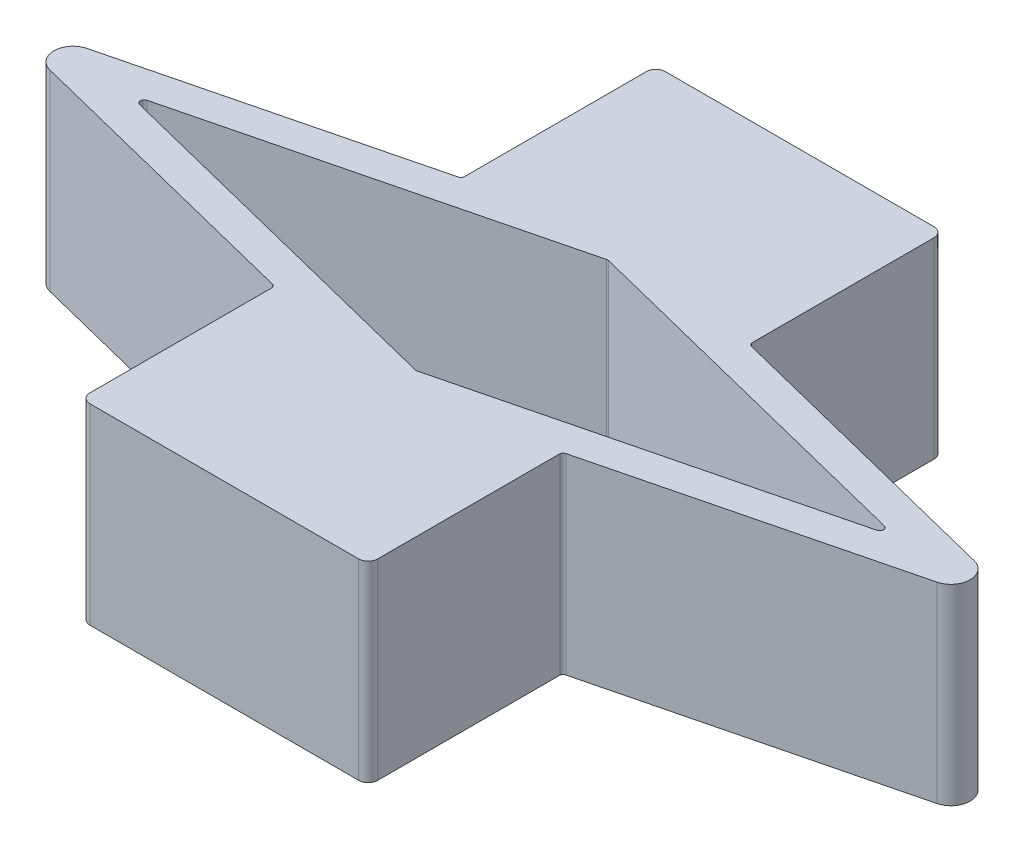
ISO-10303-21;
HEADER;
FILE_DESCRIPTION(('STEP AP214'),'2;1');
FILE_NAME('part.step','',(''),(''),'','','');
FILE_SCHEMA(('AUTOMOTIVE_DESIGN { 1 0 10303 214 1 1 1 1 }'));
ENDSEC;
DATA;
#1=APPLICATION_CONTEXT('core data for automotive mechanical design processes');
#2=APPLICATION_PROTOCOL_DEFINITION('international standard','automotive_design',2000,#1);
#3=PRODUCT_CONTEXT('',#1,'mechanical');
#4=PRODUCT('Part','Part','',(#3));
#5=PRODUCT_RELATED_PRODUCT_CATEGORY('part','',(#4));
#6=PRODUCT_DEFINITION_FORMATION('','',#4);
#7=PRODUCT_DEFINITION_CONTEXT('part definition',#1,'design');
#8=PRODUCT_DEFINITION('design','',#6,#7);
#9=PRODUCT_DEFINITION_SHAPE('','',#8);
#10=(LENGTH_UNIT() NAMED_UNIT(*) SI_UNIT(.MILLI.,.METRE.));
#11=(NAMED_UNIT(*) PLANE_ANGLE_UNIT() SI_UNIT($,.RADIAN.));
#12=(NAMED_UNIT(*) SI_UNIT($,.STERADIAN.) SOLID_ANGLE_UNIT());
#13=UNCERTAINTY_MEASURE_WITH_UNIT(LENGTH_MEASURE(1.E-05),#10,'distance_accuracy_value','');
#14=(GEOMETRIC_REPRESENTATION_CONTEXT(3) GLOBAL_UNCERTAINTY_ASSIGNED_CONTEXT((#13)) GLOBAL_UNIT_ASSIGNED_CONTEXT((#10,
#11,#12)) REPRESENTATION_CONTEXT('',''));
#15=CARTESIAN_POINT('',(0.,0.,0.));
#16=DIRECTION('',(0.,0.,1.));
#17=DIRECTION('',(1.,0.,0.));
#18=AXIS2_PLACEMENT_3D('',#15,#16,#17);
#19=CARTESIAN_POINT('',(7.5,10.,0.));
#20=DIRECTION('',(-1.,0.,0.));
#21=DIRECTION('',(0.,0.,1.));
#22=AXIS2_PLACEMENT_3D('',#19,#20,#21);
#23=PLANE('',#22);
#24=DIRECTION('',(0.,0.,-1.));
#25=VECTOR('',#24,1.);
#26=CARTESIAN_POINT('',(7.5,0.,0.));
#27=LINE('',#26,#25);
#28=CARTESIAN_POINT('',(7.5,0.,-15.));
#29=VERTEX_POINT('',#28);
#30=CARTESIAN_POINT('',(7.5,0.,-24.5));
#31=VERTEX_POINT('',#30);
#32=EDGE_CURVE('E422',#29,#31,#27,.T.);
#33=ORIENTED_EDGE('',*,*,#32,.T.);
#34=DIRECTION('',(0.,-1.,0.));
#35=VECTOR('',#34,1.);
#36=CARTESIAN_POINT('',(7.5,10.,-24.5));
#37=LINE('',#36,#35);
#38=CARTESIAN_POINT('',(7.5,10.,-24.5));
#39=VERTEX_POINT('',#38);
#40=EDGE_CURVE('E354',#31,#39,#37,.F.);
#41=ORIENTED_EDGE('',*,*,#40,.T.);
#42=DIRECTION('',(0.,0.,-1.));
#43=VECTOR('',#42,1.);
#44=CARTESIAN_POINT('',(7.5,10.,0.));
#45=LINE('',#44,#43);
#46=CARTESIAN_POINT('',(7.5,10.,-15.));
#47=VERTEX_POINT('',#46);
#48=EDGE_CURVE('E436',#47,#39,#45,.T.);
#49=ORIENTED_EDGE('',*,*,#48,.F.);
#50=DIRECTION('',(0.,-1.,0.));
#51=VECTOR('',#50,1.);
#52=CARTESIAN_POINT('',(7.5,10.,-15.));
#53=LINE('',#52,#51);
#54=EDGE_CURVE('E461',#47,#29,#53,.T.);
#55=ORIENTED_EDGE('',*,*,#54,.T.);
#56=EDGE_LOOP('',(#33,#41,#49,#55));
#57=FACE_BOUND('',#56,.T.);
#58=ADVANCED_FACE('F42',(#57),#23,.F.);
#59=CARTESIAN_POINT('',(0.,10.,-25.));
#60=DIRECTION('',(0.,0.,-1.));
#61=DIRECTION('',(-1.,0.,0.));
#62=AXIS2_PLACEMENT_3D('',#59,#60,#61);
#63=PLANE('',#62);
#64=DIRECTION('',(1.,0.,0.));
#65=VECTOR('',#64,1.);
#66=CARTESIAN_POINT('',(0.,10.,-25.));
#67=LINE('',#66,#65);
#68=CARTESIAN_POINT('',(-7.,10.,-25.));
#69=VERTEX_POINT('',#68);
#70=CARTESIAN_POINT('',(7.,10.,-25.));
#71=VERTEX_POINT('',#70);
#72=EDGE_CURVE('E439',#69,#71,#67,.T.);
#73=ORIENTED_EDGE('',*,*,#72,.T.);
#74=DIRECTION('',(0.,-1.,0.));
#75=VECTOR('',#74,1.);
#76=CARTESIAN_POINT('',(7.,0.,-25.));
#77=LINE('',#76,#75);
#78=CARTESIAN_POINT('',(7.,0.,-25.));
#79=VERTEX_POINT('',#78);
#80=EDGE_CURVE('E338',#71,#79,#77,.T.);
#81=ORIENTED_EDGE('',*,*,#80,.T.);
#82=DIRECTION('',(1.,0.,0.));
#83=VECTOR('',#82,1.);
#84=CARTESIAN_POINT('',(0.,0.,-25.));
#85=LINE('',#84,#83);
#86=CARTESIAN_POINT('',(-7.,0.,-25.));
#87=VERTEX_POINT('',#86);
#88=EDGE_CURVE('E452',#87,#79,#85,.T.);
#89=ORIENTED_EDGE('',*,*,#88,.F.);
#90=DIRECTION('',(0.,-1.,0.));
#91=VECTOR('',#90,1.);
#92=CARTESIAN_POINT('',(-7.,10.,-25.));
#93=LINE('',#92,#91);
#94=EDGE_CURVE('E335',#87,#69,#93,.F.);
#95=ORIENTED_EDGE('',*,*,#94,.T.);
#96=EDGE_LOOP('',(#73,#81,#89,#95));
#97=FACE_BOUND('',#96,.T.);
#98=ADVANCED_FACE('F597',(#97),#63,.T.);
#99=CARTESIAN_POINT('',(-7.5,10.,0.));
#100=DIRECTION('',(-1.,0.,0.));
#101=DIRECTION('',(0.,0.,1.));
#102=AXIS2_PLACEMENT_3D('',#99,#100,#101);
#103=PLANE('',#102);
#104=DIRECTION('',(0.,0.,-1.));
#105=VECTOR('',#104,1.);
#106=CARTESIAN_POINT('',(-7.5,10.,0.));
#107=LINE('',#106,#105);
#108=CARTESIAN_POINT('',(-7.5,10.,-15.));
#109=VERTEX_POINT('',#108);
#110=CARTESIAN_POINT('',(-7.5,10.,-24.5));
#111=VERTEX_POINT('',#110);
#112=EDGE_CURVE('E444',#109,#111,#107,.T.);
#113=ORIENTED_EDGE('',*,*,#112,.T.);
#114=DIRECTION('',(0.,-1.,0.));
#115=VECTOR('',#114,1.);
#116=CARTESIAN_POINT('',(-7.5,10.,-24.5));
#117=LINE('',#116,#115);
#118=CARTESIAN_POINT('',(-7.5,0.,-24.5));
#119=VERTEX_POINT('',#118);
#120=EDGE_CURVE('E368',#111,#119,#117,.T.);
#121=ORIENTED_EDGE('',*,*,#120,.T.);
#122=DIRECTION('',(0.,0.,-1.));
#123=VECTOR('',#122,1.);
#124=CARTESIAN_POINT('',(-7.5,0.,0.));
#125=LINE('',#124,#123);
#126=CARTESIAN_POINT('',(-7.5,0.,-15.));
#127=VERTEX_POINT('',#126);
#128=EDGE_CURVE('E440',#127,#119,#125,.T.);
#129=ORIENTED_EDGE('',*,*,#128,.F.);
#130=DIRECTION('',(0.,-1.,0.));
#131=VECTOR('',#130,1.);
#132=CARTESIAN_POINT('',(-7.5,10.,-15.));
#133=LINE('',#132,#131);
#134=EDGE_CURVE('E448',#109,#127,#133,.T.);
#135=ORIENTED_EDGE('',*,*,#134,.F.);
#136=EDGE_LOOP('',(#113,#121,#129,#135));
#137=FACE_BOUND('',#136,.T.);
#138=ADVANCED_FACE('F604',(#137),#103,.T.);
#139=CARTESIAN_POINT('',(0.,10.,0.));
#140=DIRECTION('',(0.,1.,0.));
#141=DIRECTION('',(0.,0.,1.));
#142=AXIS2_PLACEMENT_3D('',#139,#140,#141);
#143=PLANE('',#142);
#144=ORIENTED_EDGE('',*,*,#48,.T.);
#145=CARTESIAN_POINT('',(7.,10.,-24.5));
#146=DIRECTION('',(0.,1.,0.));
#147=DIRECTION('',(0.,0.,1.));
#148=AXIS2_PLACEMENT_3D('',#145,#146,#147);
#149=CIRCLE('',#148,0.5);
#150=EDGE_CURVE('E365',#39,#71,#149,.T.);
#151=ORIENTED_EDGE('',*,*,#150,.T.);
#152=ORIENTED_EDGE('',*,*,#72,.F.);
#153=CARTESIAN_POINT('',(-7.,10.,-24.5));
#154=DIRECTION('',(0.,1.,0.));
#155=DIRECTION('',(0.,0.,1.));
#156=AXIS2_PLACEMENT_3D('',#153,#154,#155);
#157=CIRCLE('',#156,0.5);
#158=EDGE_CURVE('E362',#69,#111,#157,.T.);
#159=ORIENTED_EDGE('',*,*,#158,.T.);
#160=ORIENTED_EDGE('',*,*,#112,.F.);
#161=CARTESIAN_POINT('',(-7.6970520970072,10.,-15.0342121479166));
#162=DIRECTION('',(0.,1.,0.));
#163=DIRECTION('',(0.,0.,1.));
#164=AXIS2_PLACEMENT_3D('',#161,#162,#163);
#165=CIRCLE('',#164,0.2);
#166=CARTESIAN_POINT('',(-7.64854497199993,10.,-14.8401836478875));
#167=VERTEX_POINT('',#166);
#168=EDGE_CURVE('E274',#109,#167,#165,.F.);
#169=ORIENTED_EDGE('',*,*,#168,.T.);
#170=DIRECTION('',(-0.970142500145332,0.,0.242535625036333));
#171=VECTOR('',#170,1.);
#172=CARTESIAN_POINT('',(-3.94172232726765,10.,-15.7668893090706));
#173=LINE('',#172,#171);
#174=CARTESIAN_POINT('',(-23.1287095629687,10.,-10.9701425001453));
#175=VERTEX_POINT('',#174);
#176=EDGE_CURVE('E406',#167,#175,#173,.T.);
#177=ORIENTED_EDGE('',*,*,#176,.T.);
#178=CARTESIAN_POINT('',(-22.8861739379324,10.,-10.));
#179=DIRECTION('',(0.,1.,0.));
#180=DIRECTION('',(0.,0.,1.));
#181=AXIS2_PLACEMENT_3D('',#178,#179,#180);
#182=CIRCLE('',#181,1.);
#183=CARTESIAN_POINT('',(-23.1287095629687,10.,-9.02985749985467));
#184=VERTEX_POINT('',#183);
#185=EDGE_CURVE('E322',#175,#184,#182,.T.);
#186=ORIENTED_EDGE('',*,*,#185,.T.);
#187=DIRECTION('',(0.970142500145332,0.,0.242535625036333));
#188=VECTOR('',#187,1.);
#189=CARTESIAN_POINT('',(0.764160025673527,10.,-3.05664010269411));
#190=LINE('',#189,#188);
#191=CARTESIAN_POINT('',(-7.64854497199993,10.,-5.15981635211247));
#192=VERTEX_POINT('',#191);
#193=EDGE_CURVE('E410',#184,#192,#190,.T.);
#194=ORIENTED_EDGE('',*,*,#193,.T.);
#195=CARTESIAN_POINT('',(-7.6970520970072,10.,-4.96578785208341));
#196=DIRECTION('',(0.,1.,0.));
#197=DIRECTION('',(0.,0.,1.));
#198=AXIS2_PLACEMENT_3D('',#195,#196,#197);
#199=CIRCLE('',#198,0.2);
#200=CARTESIAN_POINT('',(-7.5,10.,-5.));
#201=VERTEX_POINT('',#200);
#202=EDGE_CURVE('E281',#192,#201,#199,.F.);
#203=ORIENTED_EDGE('',*,*,#202,.T.);
#204=DIRECTION('',(0.,0.,-1.));
#205=VECTOR('',#204,1.);
#206=CARTESIAN_POINT('',(-7.5,10.,0.));
#207=LINE('',#206,#205);
#208=CARTESIAN_POINT('',(-7.5,10.,4.5));
#209=VERTEX_POINT('',#208);
#210=EDGE_CURVE('E239',#209,#201,#207,.T.);
#211=ORIENTED_EDGE('',*,*,#210,.F.);
#212=CARTESIAN_POINT('',(-7.,10.,4.5));
#213=DIRECTION('',(0.,1.,0.));
#214=DIRECTION('',(0.,0.,1.));
#215=AXIS2_PLACEMENT_3D('',#212,#213,#214);
#216=CIRCLE('',#215,0.5);
#217=CARTESIAN_POINT('',(-7.,10.,5.));
#218=VERTEX_POINT('',#217);
#219=EDGE_CURVE('E357',#209,#218,#216,.T.);
#220=ORIENTED_EDGE('',*,*,#219,.T.);
#221=DIRECTION('',(1.,0.,0.));
#222=VECTOR('',#221,1.);
#223=CARTESIAN_POINT('',(0.,10.,5.));
#224=LINE('',#223,#222);
#225=CARTESIAN_POINT('',(7.,10.,5.));
#226=VERTEX_POINT('',#225);
#227=EDGE_CURVE('E240',#218,#226,#224,.T.);
#228=ORIENTED_EDGE('',*,*,#227,.T.);
#229=CARTESIAN_POINT('',(7.,10.,4.5));
#230=DIRECTION('',(0.,1.,0.));
#231=DIRECTION('',(0.,0.,1.));
#232=AXIS2_PLACEMENT_3D('',#229,#230,#231);
#233=CIRCLE('',#232,0.5);
#234=CARTESIAN_POINT('',(7.5,10.,4.5));
#235=VERTEX_POINT('',#234);
#236=EDGE_CURVE('E58',#226,#235,#233,.T.);
#237=ORIENTED_EDGE('',*,*,#236,.T.);
#238=DIRECTION('',(0.,0.,-1.));
#239=VECTOR('',#238,1.);
#240=CARTESIAN_POINT('',(7.5,10.,0.));
#241=LINE('',#240,#239);
#242=CARTESIAN_POINT('',(7.5,10.,-5.));
#243=VERTEX_POINT('',#242);
#244=EDGE_CURVE('E226',#235,#243,#241,.T.);
#245=ORIENTED_EDGE('',*,*,#244,.T.);
#246=CARTESIAN_POINT('',(7.69705209700719,10.,-4.9657878520834));
#247=DIRECTION('',(0.,1.,0.));
#248=DIRECTION('',(0.,0.,1.));
#249=AXIS2_PLACEMENT_3D('',#246,#247,#248);
#250=CIRCLE('',#249,0.2);
#251=CARTESIAN_POINT('',(7.64854497199993,10.,-5.15981635211247));
#252=VERTEX_POINT('',#251);
#253=EDGE_CURVE('E233',#243,#252,#250,.F.);
#254=ORIENTED_EDGE('',*,*,#253,.T.);
#255=DIRECTION('',(-0.970142500145332,0.,0.242535625036333));
#256=VECTOR('',#255,1.);
#257=CARTESIAN_POINT('',(-0.764160025673526,10.,-3.05664010269411));
#258=LINE('',#257,#256);
#259=CARTESIAN_POINT('',(23.1287095629687,10.,-9.02985749985466));
#260=VERTEX_POINT('',#259);
#261=EDGE_CURVE('E391',#260,#252,#258,.T.);
#262=ORIENTED_EDGE('',*,*,#261,.F.);
#263=CARTESIAN_POINT('',(22.8861739379324,10.,-9.99999999999999));
#264=DIRECTION('',(0.,1.,0.));
#265=DIRECTION('',(0.,0.,1.));
#266=AXIS2_PLACEMENT_3D('',#263,#264,#265);
#267=CIRCLE('',#266,1.);
#268=CARTESIAN_POINT('',(23.1287095629687,10.,-10.9701425001453));
#269=VERTEX_POINT('',#268);
#270=EDGE_CURVE('E325',#260,#269,#267,.T.);
#271=ORIENTED_EDGE('',*,*,#270,.T.);
#272=DIRECTION('',(0.970142500145332,0.,0.242535625036333));
#273=VECTOR('',#272,1.);
#274=CARTESIAN_POINT('',(3.94172232726765,10.,-15.7668893090706));
#275=LINE('',#274,#273);
#276=CARTESIAN_POINT('',(7.64854497199993,10.,-14.8401836478875));
#277=VERTEX_POINT('',#276);
#278=EDGE_CURVE('E539',#277,#269,#275,.T.);
#279=ORIENTED_EDGE('',*,*,#278,.F.);
#280=CARTESIAN_POINT('',(7.6970520970072,10.,-15.0342121479166));
#281=DIRECTION('',(0.,1.,0.));
#282=DIRECTION('',(0.,0.,1.));
#283=AXIS2_PLACEMENT_3D('',#280,#281,#282);
#284=CIRCLE('',#283,0.2);
#285=EDGE_CURVE('E263',#277,#47,#284,.F.);
#286=ORIENTED_EDGE('',*,*,#285,.T.);
#287=EDGE_LOOP('',(#144,#151,#152,#159,#160,#169,#177,#186,#194,#203,#211,#220,#228,#237,#245,
#254,#262,#271,#279,#286));
#288=FACE_BOUND('',#287,.T.);
#289=DIRECTION('',(-0.970142500145332,0.,0.242535625036333));
#290=VECTOR('',#289,1.);
#291=CARTESIAN_POINT('',(-3.52941176470588,10.,-14.1176470588235));
#292=LINE('',#291,#290);
#293=CARTESIAN_POINT('',(-0.0485071250072634,10.,-14.9878732187482));
#294=VERTEX_POINT('',#293);
#295=CARTESIAN_POINT('',(-19.2238859998837,10.,-10.1940285000291));
#296=VERTEX_POINT('',#295);
#297=EDGE_CURVE('E418',#294,#296,#292,.T.);
#298=ORIENTED_EDGE('',*,*,#297,.F.);
#299=CARTESIAN_POINT('',(0.,10.,-14.7938447187191));
#300=DIRECTION('',(0.,1.,0.));
#301=DIRECTION('',(0.,0.,1.));
#302=AXIS2_PLACEMENT_3D('',#299,#300,#301);
#303=CIRCLE('',#302,0.2);
#304=CARTESIAN_POINT('',(0.0485071250072681,10.,-14.9878732187482));
#305=VERTEX_POINT('',#304);
#306=EDGE_CURVE('E300',#294,#305,#303,.F.);
#307=ORIENTED_EDGE('',*,*,#306,.T.);
#308=DIRECTION('',(0.970142500145332,0.,0.242535625036333));
#309=VECTOR('',#308,1.);
#310=CARTESIAN_POINT('',(3.52941176470589,10.,-14.1176470588235));
#311=LINE('',#310,#309);
#312=CARTESIAN_POINT('',(19.2238859998837,10.,-10.1940285000291));
#313=VERTEX_POINT('',#312);
#314=EDGE_CURVE('E523',#305,#313,#311,.T.);
#315=ORIENTED_EDGE('',*,*,#314,.T.);
#316=CARTESIAN_POINT('',(19.1753788748765,10.,-9.99999999999999));
#317=DIRECTION('',(0.,1.,0.));
#318=DIRECTION('',(0.,0.,1.));
#319=AXIS2_PLACEMENT_3D('',#316,#317,#318);
#320=CIRCLE('',#319,0.2);
#321=CARTESIAN_POINT('',(19.2238859998838,10.,-9.80597149997093));
#322=VERTEX_POINT('',#321);
#323=EDGE_CURVE('E294',#313,#322,#320,.F.);
#324=ORIENTED_EDGE('',*,*,#323,.T.);
#325=DIRECTION('',(-0.970142500145332,0.,0.242535625036333));
#326=VECTOR('',#325,1.);
#327=CARTESIAN_POINT('',(-1.17647058823529,10.,-4.70588235294117));
#328=LINE('',#327,#326);
#329=CARTESIAN_POINT('',(0.0485071250072686,10.,-5.01212678125181));
#330=VERTEX_POINT('',#329);
#331=EDGE_CURVE('E397',#322,#330,#328,.T.);
#332=ORIENTED_EDGE('',*,*,#331,.T.);
#333=CARTESIAN_POINT('',(0.,10.,-5.20615528128088));
#334=DIRECTION('',(0.,1.,0.));
#335=DIRECTION('',(0.,0.,1.));
#336=AXIS2_PLACEMENT_3D('',#333,#334,#335);
#337=CIRCLE('',#336,0.2);
#338=CARTESIAN_POINT('',(-0.0485071250072649,10.,-5.01212678125181));
#339=VERTEX_POINT('',#338);
#340=EDGE_CURVE('E288',#330,#339,#337,.F.);
#341=ORIENTED_EDGE('',*,*,#340,.T.);
#342=DIRECTION('',(0.970142500145332,0.,0.242535625036333));
#343=VECTOR('',#342,1.);
#344=CARTESIAN_POINT('',(1.17647058823529,10.,-4.70588235294117));
#345=LINE('',#344,#343);
#346=CARTESIAN_POINT('',(-19.2238859998837,10.,-9.80597149997093));
#347=VERTEX_POINT('',#346);
#348=EDGE_CURVE('E414',#347,#339,#345,.T.);
#349=ORIENTED_EDGE('',*,*,#348,.F.);
#350=CARTESIAN_POINT('',(-19.1753788748765,10.,-10.));
#351=DIRECTION('',(0.,1.,0.));
#352=DIRECTION('',(0.,0.,1.));
#353=AXIS2_PLACEMENT_3D('',#350,#351,#352);
#354=CIRCLE('',#353,0.2);
#355=EDGE_CURVE('E306',#347,#296,#354,.F.);
#356=ORIENTED_EDGE('',*,*,#355,.T.);
#357=EDGE_LOOP('',(#298,#307,#315,#324,#332,#341,#349,#356));
#358=FACE_BOUND('',#357,.T.);
#359=ADVANCED_FACE('F229',(#288,#358),#143,.T.);
#360=CARTESIAN_POINT('',(0.,0.,0.));
#361=DIRECTION('',(0.,1.,0.));
#362=DIRECTION('',(0.,0.,1.));
#363=AXIS2_PLACEMENT_3D('',#360,#361,#362);
#364=PLANE('',#363);
#365=ORIENTED_EDGE('',*,*,#88,.T.);
#366=CARTESIAN_POINT('',(7.,0.,-24.5));
#367=DIRECTION('',(0.,1.,0.));
#368=DIRECTION('',(0.,0.,1.));
#369=AXIS2_PLACEMENT_3D('',#366,#367,#368);
#370=CIRCLE('',#369,0.5);
#371=EDGE_CURVE('E351',#79,#31,#370,.F.);
#372=ORIENTED_EDGE('',*,*,#371,.T.);
#373=ORIENTED_EDGE('',*,*,#32,.F.);
#374=CARTESIAN_POINT('',(7.6970520970072,0.,-15.0342121479166));
#375=DIRECTION('',(0.,1.,0.));
#376=DIRECTION('',(0.,0.,1.));
#377=AXIS2_PLACEMENT_3D('',#374,#375,#376);
#378=CIRCLE('',#377,0.2);
#379=CARTESIAN_POINT('',(7.64854497199993,0.,-14.8401836478875));
#380=VERTEX_POINT('',#379);
#381=EDGE_CURVE('E258',#29,#380,#378,.T.);
#382=ORIENTED_EDGE('',*,*,#381,.T.);
#383=DIRECTION('',(0.970142500145332,0.,0.242535625036333));
#384=VECTOR('',#383,1.);
#385=CARTESIAN_POINT('',(3.94172232726765,0.,-15.7668893090706));
#386=LINE('',#385,#384);
#387=CARTESIAN_POINT('',(23.1287095629687,0.,-10.9701425001453));
#388=VERTEX_POINT('',#387);
#389=EDGE_CURVE('E527',#380,#388,#386,.T.);
#390=ORIENTED_EDGE('',*,*,#389,.T.);
#391=CARTESIAN_POINT('',(22.8861739379324,0.,-9.99999999999999));
#392=DIRECTION('',(0.,1.,0.));
#393=DIRECTION('',(0.,0.,1.));
#394=AXIS2_PLACEMENT_3D('',#391,#392,#393);
#395=CIRCLE('',#394,1.);
#396=CARTESIAN_POINT('',(23.1287095629687,0.,-9.02985749985466));
#397=VERTEX_POINT('',#396);
#398=EDGE_CURVE('E316',#388,#397,#395,.F.);
#399=ORIENTED_EDGE('',*,*,#398,.T.);
#400=DIRECTION('',(-0.970142500145332,0.,0.242535625036333));
#401=VECTOR('',#400,1.);
#402=CARTESIAN_POINT('',(-0.764160025673526,0.,-3.05664010269411));
#403=LINE('',#402,#401);
#404=CARTESIAN_POINT('',(7.64854497199993,0.,-5.15981635211247));
#405=VERTEX_POINT('',#404);
#406=EDGE_CURVE('E532',#397,#405,#403,.T.);
#407=ORIENTED_EDGE('',*,*,#406,.T.);
#408=CARTESIAN_POINT('',(7.69705209700719,0.,-4.9657878520834));
#409=DIRECTION('',(0.,1.,0.));
#410=DIRECTION('',(0.,0.,1.));
#411=AXIS2_PLACEMENT_3D('',#408,#409,#410);
#412=CIRCLE('',#411,0.2);
#413=CARTESIAN_POINT('',(7.5,0.,-5.));
#414=VERTEX_POINT('',#413);
#415=EDGE_CURVE('E259',#405,#414,#412,.T.);
#416=ORIENTED_EDGE('',*,*,#415,.T.);
#417=DIRECTION('',(0.,0.,-1.));
#418=VECTOR('',#417,1.);
#419=CARTESIAN_POINT('',(7.5,0.,0.));
#420=LINE('',#419,#418);
#421=CARTESIAN_POINT('',(7.5,0.,4.5));
#422=VERTEX_POINT('',#421);
#423=EDGE_CURVE('E246',#422,#414,#420,.T.);
#424=ORIENTED_EDGE('',*,*,#423,.F.);
#425=CARTESIAN_POINT('',(7.,0.,4.5));
#426=DIRECTION('',(0.,1.,0.));
#427=DIRECTION('',(0.,0.,1.));
#428=AXIS2_PLACEMENT_3D('',#425,#426,#427);
#429=CIRCLE('',#428,0.5);
#430=CARTESIAN_POINT('',(7.,0.,5.));
#431=VERTEX_POINT('',#430);
#432=EDGE_CURVE('E345',#422,#431,#429,.F.);
#433=ORIENTED_EDGE('',*,*,#432,.T.);
#434=DIRECTION('',(1.,0.,0.));
#435=VECTOR('',#434,1.);
#436=CARTESIAN_POINT('',(0.,0.,5.));
#437=LINE('',#436,#435);
#438=CARTESIAN_POINT('',(-7.,0.,5.));
#439=VERTEX_POINT('',#438);
#440=EDGE_CURVE('E382',#439,#431,#437,.T.);
#441=ORIENTED_EDGE('',*,*,#440,.F.);
#442=CARTESIAN_POINT('',(-7.,0.,4.5));
#443=DIRECTION('',(0.,1.,0.));
#444=DIRECTION('',(0.,0.,1.));
#445=AXIS2_PLACEMENT_3D('',#442,#443,#444);
#446=CIRCLE('',#445,0.5);
#447=CARTESIAN_POINT('',(-7.5,0.,4.5));
#448=VERTEX_POINT('',#447);
#449=EDGE_CURVE('E342',#439,#448,#446,.F.);
#450=ORIENTED_EDGE('',*,*,#449,.T.);
#451=DIRECTION('',(0.,0.,-1.));
#452=VECTOR('',#451,1.);
#453=CARTESIAN_POINT('',(-7.5,0.,0.));
#454=LINE('',#453,#452);
#455=CARTESIAN_POINT('',(-7.5,0.,-5.));
#456=VERTEX_POINT('',#455);
#457=EDGE_CURVE('E395',#448,#456,#454,.T.);
#458=ORIENTED_EDGE('',*,*,#457,.T.);
#459=CARTESIAN_POINT('',(-7.6970520970072,0.,-4.96578785208341));
#460=DIRECTION('',(0.,1.,0.));
#461=DIRECTION('',(0.,0.,1.));
#462=AXIS2_PLACEMENT_3D('',#459,#460,#461);
#463=CIRCLE('',#462,0.2);
#464=CARTESIAN_POINT('',(-7.64854497199993,0.,-5.15981635211247));
#465=VERTEX_POINT('',#464);
#466=EDGE_CURVE('E277',#456,#465,#463,.T.);
#467=ORIENTED_EDGE('',*,*,#466,.T.);
#468=DIRECTION('',(0.970142500145332,0.,0.242535625036333));
#469=VECTOR('',#468,1.);
#470=CARTESIAN_POINT('',(0.764160025673527,0.,-3.05664010269411));
#471=LINE('',#470,#469);
#472=CARTESIAN_POINT('',(-23.1287095629687,0.,-9.02985749985467));
#473=VERTEX_POINT('',#472);
#474=EDGE_CURVE('E426',#473,#465,#471,.T.);
#475=ORIENTED_EDGE('',*,*,#474,.F.);
#476=CARTESIAN_POINT('',(-22.8861739379324,0.,-10.));
#477=DIRECTION('',(0.,1.,0.));
#478=DIRECTION('',(0.,0.,1.));
#479=AXIS2_PLACEMENT_3D('',#476,#477,#478);
#480=CIRCLE('',#479,1.);
#481=CARTESIAN_POINT('',(-23.1287095629687,0.,-10.9701425001453));
#482=VERTEX_POINT('',#481);
#483=EDGE_CURVE('E313',#473,#482,#480,.F.);
#484=ORIENTED_EDGE('',*,*,#483,.T.);
#485=DIRECTION('',(-0.970142500145332,0.,0.242535625036333));
#486=VECTOR('',#485,1.);
#487=CARTESIAN_POINT('',(-3.94172232726765,0.,-15.7668893090706));
#488=LINE('',#487,#486);
#489=CARTESIAN_POINT('',(-7.64854497199993,0.,-14.8401836478875));
#490=VERTEX_POINT('',#489);
#491=EDGE_CURVE('E251',#490,#482,#488,.T.);
#492=ORIENTED_EDGE('',*,*,#491,.F.);
#493=CARTESIAN_POINT('',(-7.6970520970072,0.,-15.0342121479166));
#494=DIRECTION('',(0.,1.,0.));
#495=DIRECTION('',(0.,0.,1.));
#496=AXIS2_PLACEMENT_3D('',#493,#494,#495);
#497=CIRCLE('',#496,0.2);
#498=EDGE_CURVE('E271',#490,#127,#497,.T.);
#499=ORIENTED_EDGE('',*,*,#498,.T.);
#500=ORIENTED_EDGE('',*,*,#128,.T.);
#501=CARTESIAN_POINT('',(-7.,0.,-24.5));
#502=DIRECTION('',(0.,1.,0.));
#503=DIRECTION('',(0.,0.,1.));
#504=AXIS2_PLACEMENT_3D('',#501,#502,#503);
#505=CIRCLE('',#504,0.5);
#506=EDGE_CURVE('E348',#119,#87,#505,.F.);
#507=ORIENTED_EDGE('',*,*,#506,.T.);
#508=EDGE_LOOP('',(#365,#372,#373,#382,#390,#399,#407,#416,#424,#433,#441,#450,#458,#467,#475,
#484,#492,#499,#500,#507));
#509=FACE_BOUND('',#508,.T.);
#510=DIRECTION('',(0.970142500145332,0.,0.242535625036333));
#511=VECTOR('',#510,1.);
#512=CARTESIAN_POINT('',(3.52941176470589,0.,-14.1176470588235));
#513=LINE('',#512,#511);
#514=CARTESIAN_POINT('',(0.0485071250072681,0.,-14.9878732187482));
#515=VERTEX_POINT('',#514);
#516=CARTESIAN_POINT('',(19.2238859998837,0.,-10.1940285000291));
#517=VERTEX_POINT('',#516);
#518=EDGE_CURVE('E521',#515,#517,#513,.T.);
#519=ORIENTED_EDGE('',*,*,#518,.F.);
#520=CARTESIAN_POINT('',(0.,0.,-14.7938447187191));
#521=DIRECTION('',(0.,1.,0.));
#522=DIRECTION('',(0.,0.,1.));
#523=AXIS2_PLACEMENT_3D('',#520,#521,#522);
#524=CIRCLE('',#523,0.2);
#525=CARTESIAN_POINT('',(-0.0485071250072634,0.,-14.9878732187482));
#526=VERTEX_POINT('',#525);
#527=EDGE_CURVE('E297',#515,#526,#524,.T.);
#528=ORIENTED_EDGE('',*,*,#527,.T.);
#529=DIRECTION('',(-0.970142500145332,0.,0.242535625036333));
#530=VECTOR('',#529,1.);
#531=CARTESIAN_POINT('',(-3.52941176470588,0.,-14.1176470588235));
#532=LINE('',#531,#530);
#533=CARTESIAN_POINT('',(-19.2238859998837,0.,-10.1940285000291));
#534=VERTEX_POINT('',#533);
#535=EDGE_CURVE('E411',#526,#534,#532,.T.);
#536=ORIENTED_EDGE('',*,*,#535,.T.);
#537=CARTESIAN_POINT('',(-19.1753788748765,0.,-10.));
#538=DIRECTION('',(0.,1.,0.));
#539=DIRECTION('',(0.,0.,1.));
#540=AXIS2_PLACEMENT_3D('',#537,#538,#539);
#541=CIRCLE('',#540,0.2);
#542=CARTESIAN_POINT('',(-19.2238859998837,0.,-9.80597149997093));
#543=VERTEX_POINT('',#542);
#544=EDGE_CURVE('E303',#534,#543,#541,.T.);
#545=ORIENTED_EDGE('',*,*,#544,.T.);
#546=DIRECTION('',(0.970142500145332,0.,0.242535625036333));
#547=VECTOR('',#546,1.);
#548=CARTESIAN_POINT('',(1.17647058823529,0.,-4.70588235294117));
#549=LINE('',#548,#547);
#550=CARTESIAN_POINT('',(-0.0485071250072649,0.,-5.01212678125181));
#551=VERTEX_POINT('',#550);
#552=EDGE_CURVE('E429',#543,#551,#549,.T.);
#553=ORIENTED_EDGE('',*,*,#552,.T.);
#554=CARTESIAN_POINT('',(0.,0.,-5.20615528128088));
#555=DIRECTION('',(0.,1.,0.));
#556=DIRECTION('',(0.,0.,1.));
#557=AXIS2_PLACEMENT_3D('',#554,#555,#556);
#558=CIRCLE('',#557,0.2);
#559=CARTESIAN_POINT('',(0.0485071250072686,0.,-5.01212678125181));
#560=VERTEX_POINT('',#559);
#561=EDGE_CURVE('E285',#551,#560,#558,.T.);
#562=ORIENTED_EDGE('',*,*,#561,.T.);
#563=DIRECTION('',(-0.970142500145332,0.,0.242535625036333));
#564=VECTOR('',#563,1.);
#565=CARTESIAN_POINT('',(-1.17647058823529,0.,-4.70588235294117));
#566=LINE('',#565,#564);
#567=CARTESIAN_POINT('',(19.2238859998838,0.,-9.80597149997093));
#568=VERTEX_POINT('',#567);
#569=EDGE_CURVE('E526',#568,#560,#566,.T.);
#570=ORIENTED_EDGE('',*,*,#569,.F.);
#571=CARTESIAN_POINT('',(19.1753788748765,0.,-9.99999999999999));
#572=DIRECTION('',(0.,1.,0.));
#573=DIRECTION('',(0.,0.,1.));
#574=AXIS2_PLACEMENT_3D('',#571,#572,#573);
#575=CIRCLE('',#574,0.2);
#576=EDGE_CURVE('E291',#568,#517,#575,.T.);
#577=ORIENTED_EDGE('',*,*,#576,.T.);
#578=EDGE_LOOP('',(#519,#528,#536,#545,#553,#562,#570,#577));
#579=FACE_BOUND('',#578,.T.);
#580=ADVANCED_FACE('F387',(#509,#579),#364,.F.);
#581=CARTESIAN_POINT('',(-3.94172232726765,10.,-15.7668893090706));
#582=DIRECTION('',(0.242535625036333,0.,0.970142500145332));
#583=DIRECTION('',(0.970142500145332,0.,-0.242535625036333));
#584=AXIS2_PLACEMENT_3D('',#581,#582,#583);
#585=PLANE('',#584);
#586=ORIENTED_EDGE('',*,*,#491,.T.);
#587=DIRECTION('',(0.,-1.,0.));
#588=VECTOR('',#587,1.);
#589=CARTESIAN_POINT('',(-23.1287095629687,10.,-10.9701425001453));
#590=LINE('',#589,#588);
#591=EDGE_CURVE('E332',#482,#175,#590,.F.);
#592=ORIENTED_EDGE('',*,*,#591,.T.);
#593=ORIENTED_EDGE('',*,*,#176,.F.);
#594=DIRECTION('',(0.,1.,0.));
#595=VECTOR('',#594,1.);
#596=CARTESIAN_POINT('',(-7.64854497199993,10.,-14.8401836478875));
#597=LINE('',#596,#595);
#598=EDGE_CURVE('E470',#167,#490,#597,.F.);
#599=ORIENTED_EDGE('',*,*,#598,.T.);
#600=EDGE_LOOP('',(#586,#592,#593,#599));
#601=FACE_BOUND('',#600,.T.);
#602=ADVANCED_FACE('F654',(#601),#585,.F.);
#603=CARTESIAN_POINT('',(0.764160025673527,10.,-3.05664010269411));
#604=DIRECTION('',(0.242535625036333,0.,-0.970142500145332));
#605=DIRECTION('',(-0.970142500145332,0.,-0.242535625036333));
#606=AXIS2_PLACEMENT_3D('',#603,#604,#605);
#607=PLANE('',#606);
#608=ORIENTED_EDGE('',*,*,#193,.F.);
#609=DIRECTION('',(0.,-1.,0.));
#610=VECTOR('',#609,1.);
#611=CARTESIAN_POINT('',(-23.1287095629687,10.,-9.02985749985467));
#612=LINE('',#611,#610);
#613=EDGE_CURVE('E328',#184,#473,#612,.T.);
#614=ORIENTED_EDGE('',*,*,#613,.T.);
#615=ORIENTED_EDGE('',*,*,#474,.T.);
#616=DIRECTION('',(0.,1.,0.));
#617=VECTOR('',#616,1.);
#618=CARTESIAN_POINT('',(-7.64854497199993,10.,-5.15981635211247));
#619=LINE('',#618,#617);
#620=EDGE_CURVE('E474',#465,#192,#619,.T.);
#621=ORIENTED_EDGE('',*,*,#620,.T.);
#622=EDGE_LOOP('',(#608,#614,#615,#621));
#623=FACE_BOUND('',#622,.T.);
#624=ADVANCED_FACE('F651',(#623),#607,.F.);
#625=CARTESIAN_POINT('',(1.17647058823529,10.,-4.70588235294117));
#626=DIRECTION('',(0.242535625036333,0.,-0.970142500145332));
#627=DIRECTION('',(-0.970142500145332,0.,-0.242535625036333));
#628=AXIS2_PLACEMENT_3D('',#625,#626,#627);
#629=PLANE('',#628);
#630=ORIENTED_EDGE('',*,*,#348,.T.);
#631=DIRECTION('',(0.,-1.,0.));
#632=VECTOR('',#631,1.);
#633=CARTESIAN_POINT('',(-0.0485071250072647,10.,-5.01212678125181));
#634=LINE('',#633,#632);
#635=EDGE_CURVE('E481',#339,#551,#634,.T.);
#636=ORIENTED_EDGE('',*,*,#635,.T.);
#637=ORIENTED_EDGE('',*,*,#552,.F.);
#638=DIRECTION('',(0.,-1.,0.));
#639=VECTOR('',#638,1.);
#640=CARTESIAN_POINT('',(-19.2238859998837,10.,-9.80597149997093));
#641=LINE('',#640,#639);
#642=EDGE_CURVE('E478',#543,#347,#641,.F.);
#643=ORIENTED_EDGE('',*,*,#642,.T.);
#644=EDGE_LOOP('',(#630,#636,#637,#643));
#645=FACE_BOUND('',#644,.T.);
#646=ADVANCED_FACE('F582',(#645),#629,.T.);
#647=CARTESIAN_POINT('',(-3.52941176470588,10.,-14.1176470588235));
#648=DIRECTION('',(0.242535625036333,0.,0.970142500145332));
#649=DIRECTION('',(0.970142500145332,0.,-0.242535625036333));
#650=AXIS2_PLACEMENT_3D('',#647,#648,#649);
#651=PLANE('',#650);
#652=ORIENTED_EDGE('',*,*,#535,.F.);
#653=DIRECTION('',(0.,-1.,0.));
#654=VECTOR('',#653,1.);
#655=CARTESIAN_POINT('',(-0.0485071250072647,10.,-14.9878732187482));
#656=LINE('',#655,#654);
#657=EDGE_CURVE('E265',#526,#294,#656,.F.);
#658=ORIENTED_EDGE('',*,*,#657,.T.);
#659=ORIENTED_EDGE('',*,*,#297,.T.);
#660=DIRECTION('',(0.,-1.,0.));
#661=VECTOR('',#660,1.);
#662=CARTESIAN_POINT('',(-19.2238859998837,0.,-10.1940285000291));
#663=LINE('',#662,#661);
#664=EDGE_CURVE('E499',#296,#534,#663,.T.);
#665=ORIENTED_EDGE('',*,*,#664,.T.);
#666=EDGE_LOOP('',(#652,#658,#659,#665));
#667=FACE_BOUND('',#666,.T.);
#668=ADVANCED_FACE('F507',(#667),#651,.T.);
#669=CARTESIAN_POINT('',(0.,10.,5.));
#670=DIRECTION('',(0.,0.,-1.));
#671=DIRECTION('',(-1.,0.,0.));
#672=AXIS2_PLACEMENT_3D('',#669,#670,#671);
#673=PLANE('',#672);
#674=ORIENTED_EDGE('',*,*,#440,.T.);
#675=DIRECTION('',(0.,-1.,0.));
#676=VECTOR('',#675,1.);
#677=CARTESIAN_POINT('',(7.,10.,5.));
#678=LINE('',#677,#676);
#679=EDGE_CURVE('E51',#431,#226,#678,.F.);
#680=ORIENTED_EDGE('',*,*,#679,.T.);
#681=ORIENTED_EDGE('',*,*,#227,.F.);
#682=DIRECTION('',(0.,-1.,0.));
#683=VECTOR('',#682,1.);
#684=CARTESIAN_POINT('',(-7.,0.,5.));
#685=LINE('',#684,#683);
#686=EDGE_CURVE('E375',#218,#439,#685,.T.);
#687=ORIENTED_EDGE('',*,*,#686,.T.);
#688=EDGE_LOOP('',(#674,#680,#681,#687));
#689=FACE_BOUND('',#688,.T.);
#690=ADVANCED_FACE('F381',(#689),#673,.F.);
#691=CARTESIAN_POINT('',(7.5,10.,0.));
#692=DIRECTION('',(-1.,0.,0.));
#693=DIRECTION('',(0.,0.,1.));
#694=AXIS2_PLACEMENT_3D('',#691,#692,#693);
#695=PLANE('',#694);
#696=ORIENTED_EDGE('',*,*,#244,.F.);
#697=DIRECTION('',(0.,-1.,0.));
#698=VECTOR('',#697,1.);
#699=CARTESIAN_POINT('',(7.5,10.,4.5));
#700=LINE('',#699,#698);
#701=EDGE_CURVE('E372',#235,#422,#700,.T.);
#702=ORIENTED_EDGE('',*,*,#701,.T.);
#703=ORIENTED_EDGE('',*,*,#423,.T.);
#704=DIRECTION('',(0.,-1.,0.));
#705=VECTOR('',#704,1.);
#706=CARTESIAN_POINT('',(7.5,10.,-5.));
#707=LINE('',#706,#705);
#708=EDGE_CURVE('E243',#243,#414,#707,.T.);
#709=ORIENTED_EDGE('',*,*,#708,.F.);
#710=EDGE_LOOP('',(#696,#702,#703,#709));
#711=FACE_BOUND('',#710,.T.);
#712=ADVANCED_FACE('F244',(#711),#695,.F.);
#713=CARTESIAN_POINT('',(-7.5,10.,0.));
#714=DIRECTION('',(-1.,0.,0.));
#715=DIRECTION('',(0.,0.,1.));
#716=AXIS2_PLACEMENT_3D('',#713,#714,#715);
#717=PLANE('',#716);
#718=ORIENTED_EDGE('',*,*,#457,.F.);
#719=DIRECTION('',(0.,-1.,0.));
#720=VECTOR('',#719,1.);
#721=CARTESIAN_POINT('',(-7.5,10.,4.5));
#722=LINE('',#721,#720);
#723=EDGE_CURVE('E11',#448,#209,#722,.F.);
#724=ORIENTED_EDGE('',*,*,#723,.T.);
#725=ORIENTED_EDGE('',*,*,#210,.T.);
#726=DIRECTION('',(0.,-1.,0.));
#727=VECTOR('',#726,1.);
#728=CARTESIAN_POINT('',(-7.5,10.,-5.));
#729=LINE('',#728,#727);
#730=EDGE_CURVE('E252',#201,#456,#729,.T.);
#731=ORIENTED_EDGE('',*,*,#730,.T.);
#732=EDGE_LOOP('',(#718,#724,#725,#731));
#733=FACE_BOUND('',#732,.T.);
#734=ADVANCED_FACE('F639',(#733),#717,.T.);
#735=CARTESIAN_POINT('',(3.94172232726765,10.,-15.7668893090706));
#736=DIRECTION('',(0.242535625036333,0.,-0.970142500145332));
#737=DIRECTION('',(-0.970142500145332,0.,-0.242535625036333));
#738=AXIS2_PLACEMENT_3D('',#735,#736,#737);
#739=PLANE('',#738);
#740=ORIENTED_EDGE('',*,*,#278,.T.);
#741=DIRECTION('',(0.,-1.,0.));
#742=VECTOR('',#741,1.);
#743=CARTESIAN_POINT('',(23.1287095629687,10.,-10.9701425001453));
#744=LINE('',#743,#742);
#745=EDGE_CURVE('E309',#269,#388,#744,.T.);
#746=ORIENTED_EDGE('',*,*,#745,.T.);
#747=ORIENTED_EDGE('',*,*,#389,.F.);
#748=DIRECTION('',(0.,-1.,0.));
#749=VECTOR('',#748,1.);
#750=CARTESIAN_POINT('',(7.64854497199993,10.,-14.8401836478875));
#751=LINE('',#750,#749);
#752=EDGE_CURVE('E467',#380,#277,#751,.F.);
#753=ORIENTED_EDGE('',*,*,#752,.T.);
#754=EDGE_LOOP('',(#740,#746,#747,#753));
#755=FACE_BOUND('',#754,.T.);
#756=ADVANCED_FACE('F556',(#755),#739,.T.);
#757=CARTESIAN_POINT('',(3.52941176470589,10.,-14.1176470588235));
#758=DIRECTION('',(0.242535625036333,0.,-0.970142500145332));
#759=DIRECTION('',(-0.970142500145332,0.,-0.242535625036333));
#760=AXIS2_PLACEMENT_3D('',#757,#758,#759);
#761=PLANE('',#760);
#762=ORIENTED_EDGE('',*,*,#518,.T.);
#763=DIRECTION('',(0.,-1.,0.));
#764=VECTOR('',#763,1.);
#765=CARTESIAN_POINT('',(19.2238859998837,10.,-10.1940285000291));
#766=LINE('',#765,#764);
#767=EDGE_CURVE('E496',#517,#313,#766,.F.);
#768=ORIENTED_EDGE('',*,*,#767,.T.);
#769=ORIENTED_EDGE('',*,*,#314,.F.);
#770=DIRECTION('',(0.,-1.,0.));
#771=VECTOR('',#770,1.);
#772=CARTESIAN_POINT('',(0.048507125007269,10.,-14.9878732187482));
#773=LINE('',#772,#771);
#774=EDGE_CURVE('E492',#305,#515,#773,.T.);
#775=ORIENTED_EDGE('',*,*,#774,.T.);
#776=EDGE_LOOP('',(#762,#768,#769,#775));
#777=FACE_BOUND('',#776,.T.);
#778=ADVANCED_FACE('F520',(#777),#761,.F.);
#779=CARTESIAN_POINT('',(-1.17647058823529,10.,-4.70588235294117));
#780=DIRECTION('',(0.242535625036333,0.,0.970142500145332));
#781=DIRECTION('',(0.970142500145332,0.,-0.242535625036333));
#782=AXIS2_PLACEMENT_3D('',#779,#780,#781);
#783=PLANE('',#782);
#784=ORIENTED_EDGE('',*,*,#569,.T.);
#785=DIRECTION('',(0.,-1.,0.));
#786=VECTOR('',#785,1.);
#787=CARTESIAN_POINT('',(0.0485071250072679,10.,-5.01212678125181));
#788=LINE('',#787,#786);
#789=EDGE_CURVE('E489',#560,#330,#788,.F.);
#790=ORIENTED_EDGE('',*,*,#789,.T.);
#791=ORIENTED_EDGE('',*,*,#331,.F.);
#792=DIRECTION('',(0.,-1.,0.));
#793=VECTOR('',#792,1.);
#794=CARTESIAN_POINT('',(19.2238859998837,0.,-9.80597149997093));
#795=LINE('',#794,#793);
#796=EDGE_CURVE('E485',#322,#568,#795,.T.);
#797=ORIENTED_EDGE('',*,*,#796,.T.);
#798=EDGE_LOOP('',(#784,#790,#791,#797));
#799=FACE_BOUND('',#798,.T.);
#800=ADVANCED_FACE('F627',(#799),#783,.F.);
#801=CARTESIAN_POINT('',(-0.764160025673526,10.,-3.05664010269411));
#802=DIRECTION('',(0.242535625036333,0.,0.970142500145332));
#803=DIRECTION('',(0.970142500145332,0.,-0.242535625036333));
#804=AXIS2_PLACEMENT_3D('',#801,#802,#803);
#805=PLANE('',#804);
#806=ORIENTED_EDGE('',*,*,#406,.F.);
#807=DIRECTION('',(0.,-1.,0.));
#808=VECTOR('',#807,1.);
#809=CARTESIAN_POINT('',(23.1287095629687,10.,-9.02985749985466));
#810=LINE('',#809,#808);
#811=EDGE_CURVE('E319',#397,#260,#810,.F.);
#812=ORIENTED_EDGE('',*,*,#811,.T.);
#813=ORIENTED_EDGE('',*,*,#261,.T.);
#814=DIRECTION('',(0.,-1.,0.));
#815=VECTOR('',#814,1.);
#816=CARTESIAN_POINT('',(7.64854497199993,0.,-5.15981635211247));
#817=LINE('',#816,#815);
#818=EDGE_CURVE('E256',#252,#405,#817,.T.);
#819=ORIENTED_EDGE('',*,*,#818,.T.);
#820=EDGE_LOOP('',(#806,#812,#813,#819));
#821=FACE_BOUND('',#820,.T.);
#822=ADVANCED_FACE('F546',(#821),#805,.T.);
#823=CARTESIAN_POINT('',(7.69705209700719,10.,-4.9657878520834));
#824=DIRECTION('',(0.,1.,0.));
#825=DIRECTION('',(0.,0.,1.));
#826=AXIS2_PLACEMENT_3D('',#823,#824,#825);
#827=CYLINDRICAL_SURFACE('',#826,0.2);
#828=ORIENTED_EDGE('',*,*,#253,.F.);
#829=ORIENTED_EDGE('',*,*,#708,.T.);
#830=ORIENTED_EDGE('',*,*,#415,.F.);
#831=ORIENTED_EDGE('',*,*,#818,.F.);
#832=EDGE_LOOP('',(#828,#829,#830,#831));
#833=FACE_BOUND('',#832,.T.);
#834=ADVANCED_FACE('F254',(#833),#827,.F.);
#835=CARTESIAN_POINT('',(7.6970520970072,10.,-15.0342121479166));
#836=DIRECTION('',(0.,1.,0.));
#837=DIRECTION('',(0.,0.,1.));
#838=AXIS2_PLACEMENT_3D('',#835,#836,#837);
#839=CYLINDRICAL_SURFACE('',#838,0.2);
#840=ORIENTED_EDGE('',*,*,#285,.F.);
#841=ORIENTED_EDGE('',*,*,#752,.F.);
#842=ORIENTED_EDGE('',*,*,#381,.F.);
#843=ORIENTED_EDGE('',*,*,#54,.F.);
#844=EDGE_LOOP('',(#840,#841,#842,#843));
#845=FACE_BOUND('',#844,.T.);
#846=ADVANCED_FACE('F562',(#845),#839,.F.);
#847=CARTESIAN_POINT('',(-7.6970520970072,10.,-15.0342121479166));
#848=DIRECTION('',(0.,1.,0.));
#849=DIRECTION('',(0.,0.,1.));
#850=AXIS2_PLACEMENT_3D('',#847,#848,#849);
#851=CYLINDRICAL_SURFACE('',#850,0.2);
#852=ORIENTED_EDGE('',*,*,#168,.F.);
#853=ORIENTED_EDGE('',*,*,#134,.T.);
#854=ORIENTED_EDGE('',*,*,#498,.F.);
#855=ORIENTED_EDGE('',*,*,#598,.F.);
#856=EDGE_LOOP('',(#852,#853,#854,#855));
#857=FACE_BOUND('',#856,.T.);
#858=ADVANCED_FACE('F613',(#857),#851,.F.);
#859=CARTESIAN_POINT('',(-7.6970520970072,10.,-4.96578785208341));
#860=DIRECTION('',(0.,1.,0.));
#861=DIRECTION('',(0.,0.,1.));
#862=AXIS2_PLACEMENT_3D('',#859,#860,#861);
#863=CYLINDRICAL_SURFACE('',#862,0.2);
#864=ORIENTED_EDGE('',*,*,#202,.F.);
#865=ORIENTED_EDGE('',*,*,#620,.F.);
#866=ORIENTED_EDGE('',*,*,#466,.F.);
#867=ORIENTED_EDGE('',*,*,#730,.F.);
#868=EDGE_LOOP('',(#864,#865,#866,#867));
#869=FACE_BOUND('',#868,.T.);
#870=ADVANCED_FACE('F616',(#869),#863,.F.);
#871=CARTESIAN_POINT('',(0.,10.,-5.20615528128088));
#872=DIRECTION('',(0.,-1.,0.));
#873=DIRECTION('',(0.,0.,-1.));
#874=AXIS2_PLACEMENT_3D('',#871,#872,#873);
#875=CYLINDRICAL_SURFACE('',#874,0.2);
#876=ORIENTED_EDGE('',*,*,#340,.F.);
#877=ORIENTED_EDGE('',*,*,#789,.F.);
#878=ORIENTED_EDGE('',*,*,#561,.F.);
#879=ORIENTED_EDGE('',*,*,#635,.F.);
#880=EDGE_LOOP('',(#876,#877,#878,#879));
#881=FACE_BOUND('',#880,.T.);
#882=ADVANCED_FACE('F579',(#881),#875,.F.);
#883=CARTESIAN_POINT('',(19.1753788748765,10.,-9.99999999999999));
#884=DIRECTION('',(0.,1.,0.));
#885=DIRECTION('',(0.,0.,1.));
#886=AXIS2_PLACEMENT_3D('',#883,#884,#885);
#887=CYLINDRICAL_SURFACE('',#886,0.2);
#888=ORIENTED_EDGE('',*,*,#323,.F.);
#889=ORIENTED_EDGE('',*,*,#767,.F.);
#890=ORIENTED_EDGE('',*,*,#576,.F.);
#891=ORIENTED_EDGE('',*,*,#796,.F.);
#892=EDGE_LOOP('',(#888,#889,#890,#891));
#893=FACE_BOUND('',#892,.T.);
#894=ADVANCED_FACE('F594',(#893),#887,.F.);
#895=CARTESIAN_POINT('',(0.,10.,-14.7938447187191));
#896=DIRECTION('',(0.,-1.,0.));
#897=DIRECTION('',(0.,0.,-1.));
#898=AXIS2_PLACEMENT_3D('',#895,#896,#897);
#899=CYLINDRICAL_SURFACE('',#898,0.2);
#900=ORIENTED_EDGE('',*,*,#306,.F.);
#901=ORIENTED_EDGE('',*,*,#657,.F.);
#902=ORIENTED_EDGE('',*,*,#527,.F.);
#903=ORIENTED_EDGE('',*,*,#774,.F.);
#904=EDGE_LOOP('',(#900,#901,#902,#903));
#905=FACE_BOUND('',#904,.T.);
#906=ADVANCED_FACE('F516',(#905),#899,.F.);
#907=CARTESIAN_POINT('',(-19.1753788748765,10.,-10.));
#908=DIRECTION('',(0.,1.,0.));
#909=DIRECTION('',(0.,0.,1.));
#910=AXIS2_PLACEMENT_3D('',#907,#908,#909);
#911=CYLINDRICAL_SURFACE('',#910,0.2);
#912=ORIENTED_EDGE('',*,*,#355,.F.);
#913=ORIENTED_EDGE('',*,*,#642,.F.);
#914=ORIENTED_EDGE('',*,*,#544,.F.);
#915=ORIENTED_EDGE('',*,*,#664,.F.);
#916=EDGE_LOOP('',(#912,#913,#914,#915));
#917=FACE_BOUND('',#916,.T.);
#918=ADVANCED_FACE('F585',(#917),#911,.F.);
#919=CARTESIAN_POINT('',(22.8861739379324,10.,-9.99999999999999));
#920=DIRECTION('',(0.,-1.,0.));
#921=DIRECTION('',(0.,0.,-1.));
#922=AXIS2_PLACEMENT_3D('',#919,#920,#921);
#923=CYLINDRICAL_SURFACE('',#922,1.);
#924=ORIENTED_EDGE('',*,*,#270,.F.);
#925=ORIENTED_EDGE('',*,*,#811,.F.);
#926=ORIENTED_EDGE('',*,*,#398,.F.);
#927=ORIENTED_EDGE('',*,*,#745,.F.);
#928=EDGE_LOOP('',(#924,#925,#926,#927));
#929=FACE_BOUND('',#928,.T.);
#930=ADVANCED_FACE('F553',(#929),#923,.T.);
#931=CARTESIAN_POINT('',(-22.8861739379324,10.,-10.));
#932=DIRECTION('',(0.,-1.,0.));
#933=DIRECTION('',(0.,0.,-1.));
#934=AXIS2_PLACEMENT_3D('',#931,#932,#933);
#935=CYLINDRICAL_SURFACE('',#934,1.);
#936=ORIENTED_EDGE('',*,*,#185,.F.);
#937=ORIENTED_EDGE('',*,*,#591,.F.);
#938=ORIENTED_EDGE('',*,*,#483,.F.);
#939=ORIENTED_EDGE('',*,*,#613,.F.);
#940=EDGE_LOOP('',(#936,#937,#938,#939));
#941=FACE_BOUND('',#940,.T.);
#942=ADVANCED_FACE('F592',(#941),#935,.T.);
#943=CARTESIAN_POINT('',(7.,10.,-24.5));
#944=DIRECTION('',(0.,1.,0.));
#945=DIRECTION('',(0.,0.,1.));
#946=AXIS2_PLACEMENT_3D('',#943,#944,#945);
#947=CYLINDRICAL_SURFACE('',#946,0.5);
#948=ORIENTED_EDGE('',*,*,#150,.F.);
#949=ORIENTED_EDGE('',*,*,#40,.F.);
#950=ORIENTED_EDGE('',*,*,#371,.F.);
#951=ORIENTED_EDGE('',*,*,#80,.F.);
#952=EDGE_LOOP('',(#948,#949,#950,#951));
#953=FACE_BOUND('',#952,.T.);
#954=ADVANCED_FACE('F679',(#953),#947,.T.);
#955=CARTESIAN_POINT('',(-7.,10.,-24.5));
#956=DIRECTION('',(0.,-1.,0.));
#957=DIRECTION('',(0.,0.,-1.));
#958=AXIS2_PLACEMENT_3D('',#955,#956,#957);
#959=CYLINDRICAL_SURFACE('',#958,0.5);
#960=ORIENTED_EDGE('',*,*,#158,.F.);
#961=ORIENTED_EDGE('',*,*,#94,.F.);
#962=ORIENTED_EDGE('',*,*,#506,.F.);
#963=ORIENTED_EDGE('',*,*,#120,.F.);
#964=EDGE_LOOP('',(#960,#961,#962,#963));
#965=FACE_BOUND('',#964,.T.);
#966=ADVANCED_FACE('F672',(#965),#959,.T.);
#967=CARTESIAN_POINT('',(7.,10.,4.5));
#968=DIRECTION('',(0.,-1.,0.));
#969=DIRECTION('',(0.,0.,-1.));
#970=AXIS2_PLACEMENT_3D('',#967,#968,#969);
#971=CYLINDRICAL_SURFACE('',#970,0.5);
#972=ORIENTED_EDGE('',*,*,#236,.F.);
#973=ORIENTED_EDGE('',*,*,#679,.F.);
#974=ORIENTED_EDGE('',*,*,#432,.F.);
#975=ORIENTED_EDGE('',*,*,#701,.F.);
#976=EDGE_LOOP('',(#972,#973,#974,#975));
#977=FACE_BOUND('',#976,.T.);
#978=ADVANCED_FACE('F543',(#977),#971,.T.);
#979=CARTESIAN_POINT('',(-7.,10.,4.5));
#980=DIRECTION('',(0.,1.,0.));
#981=DIRECTION('',(0.,0.,1.));
#982=AXIS2_PLACEMENT_3D('',#979,#980,#981);
#983=CYLINDRICAL_SURFACE('',#982,0.5);
#984=ORIENTED_EDGE('',*,*,#219,.F.);
#985=ORIENTED_EDGE('',*,*,#723,.F.);
#986=ORIENTED_EDGE('',*,*,#449,.F.);
#987=ORIENTED_EDGE('',*,*,#686,.F.);
#988=EDGE_LOOP('',(#984,#985,#986,#987));
#989=FACE_BOUND('',#988,.T.);
#990=ADVANCED_FACE('F44',(#989),#983,.T.);
#991=CLOSED_SHELL('',(#58,#98,#138,#359,#580,#602,#624,#646,#668,#690,#712,#734,#756,#778,#800,
#822,#834,#846,#858,#870,#882,#894,#906,#918,#930,#942,#954,#966,#978,#990));
#992=MANIFOLD_SOLID_BREP('B2',#991);
#993=ADVANCED_BREP_SHAPE_REPRESENTATION('',(#18,#992),#14);
#994=SHAPE_DEFINITION_REPRESENTATION(#9,#993);
ENDSEC;
END-ISO-10303-21;
